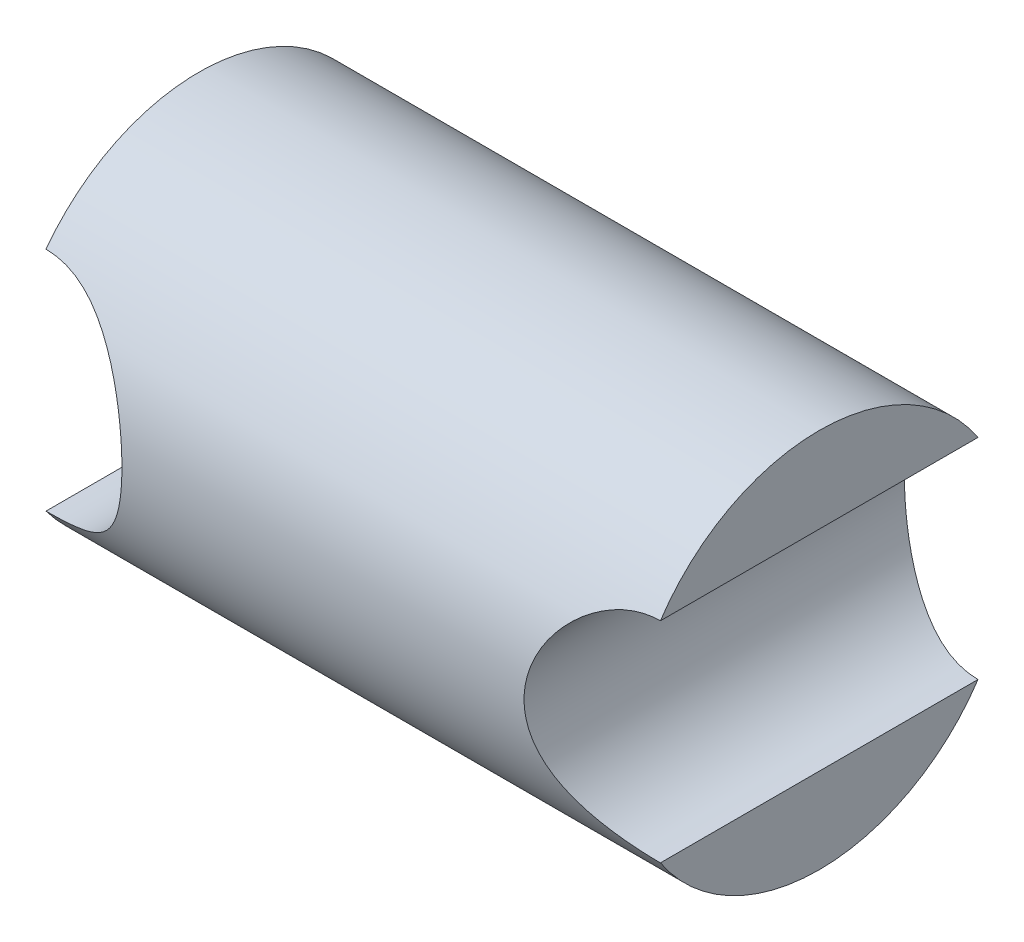
ISO-10303-21;
HEADER;
FILE_DESCRIPTION(('STEP AP214'),'2;1');
FILE_NAME('part.step','',(''),(''),'','','');
FILE_SCHEMA(('AUTOMOTIVE_DESIGN { 1 0 10303 214 1 1 1 1 }'));
ENDSEC;
DATA;
#1=APPLICATION_CONTEXT('core data for automotive mechanical design processes');
#2=APPLICATION_PROTOCOL_DEFINITION('international standard','automotive_design',2000,#1);
#3=PRODUCT_CONTEXT('',#1,'mechanical');
#4=PRODUCT('Part','Part','',(#3));
#5=PRODUCT_RELATED_PRODUCT_CATEGORY('part','',(#4));
#6=PRODUCT_DEFINITION_FORMATION('','',#4);
#7=PRODUCT_DEFINITION_CONTEXT('part definition',#1,'design');
#8=PRODUCT_DEFINITION('design','',#6,#7);
#9=PRODUCT_DEFINITION_SHAPE('','',#8);
#10=(LENGTH_UNIT() NAMED_UNIT(*) SI_UNIT(.MILLI.,.METRE.));
#11=(NAMED_UNIT(*) PLANE_ANGLE_UNIT() SI_UNIT($,.RADIAN.));
#12=(NAMED_UNIT(*) SI_UNIT($,.STERADIAN.) SOLID_ANGLE_UNIT());
#13=UNCERTAINTY_MEASURE_WITH_UNIT(LENGTH_MEASURE(1.E-05),#10,'distance_accuracy_value','');
#14=(GEOMETRIC_REPRESENTATION_CONTEXT(3) GLOBAL_UNCERTAINTY_ASSIGNED_CONTEXT((#13)) GLOBAL_UNIT_ASSIGNED_CONTEXT((#10,
#11,#12)) REPRESENTATION_CONTEXT('',''));
#15=CARTESIAN_POINT('',(0.,0.,0.));
#16=DIRECTION('',(0.,0.,1.));
#17=DIRECTION('',(1.,0.,0.));
#18=AXIS2_PLACEMENT_3D('',#15,#16,#17);
#19=CARTESIAN_POINT('',(75.,0.,0.));
#20=DIRECTION('',(-1.,0.,0.));
#21=DIRECTION('',(0.,0.,1.));
#22=AXIS2_PLACEMENT_3D('',#19,#20,#21);
#23=CYLINDRICAL_SURFACE('',#22,23.);
#24=CARTESIAN_POINT('',(75.,-12.6701406368447,19.1955082309007));
#25=CARTESIAN_POINT('',(74.8369294760517,-12.6703725699019,19.1953515760814));
#26=CARTESIAN_POINT('',(74.6738765209561,-12.6674524483349,19.197283010189));
#27=CARTESIAN_POINT('',(74.348114196428,-12.6553313683796,19.2052770578598));
#28=CARTESIAN_POINT('',(74.1854048090592,-12.6461307464331,19.2113394501303));
#29=CARTESIAN_POINT('',(73.6985568130561,-12.6091674984424,19.2356394955028));
#30=CARTESIAN_POINT('',(73.3753673887891,-12.5720438529932,19.2599898902889));
#31=CARTESIAN_POINT('',(72.7365402763044,-12.4737340733277,19.3238021572105));
#32=CARTESIAN_POINT('',(72.4208661148813,-12.4127137929539,19.3631598233005));
#33=CARTESIAN_POINT('',(71.7969146387665,-12.2674364029484,19.4555236461787));
#34=CARTESIAN_POINT('',(71.4886384537322,-12.1831757687916,19.508531873067));
#35=CARTESIAN_POINT('',(70.8822749260622,-11.9927037483855,19.626195030197));
#36=CARTESIAN_POINT('',(70.5841607617617,-11.8865563719188,19.6908159288654));
#37=CARTESIAN_POINT('',(69.9986688477942,-11.6532194229001,19.8297983823622));
#38=CARTESIAN_POINT('',(69.711290885988,-11.5260302663873,19.9041597445955));
#39=CARTESIAN_POINT('',(69.1479533911269,-11.2513953328332,20.0606858463557));
#40=CARTESIAN_POINT('',(68.8720148260924,-11.1039143277573,20.1428640782016));
#41=CARTESIAN_POINT('',(68.3330510519983,-10.7898212572092,20.3128443216903));
#42=CARTESIAN_POINT('',(68.0700271254207,-10.623207297211,20.400646889868));
#43=CARTESIAN_POINT('',(67.5320472002041,-10.2540885503507,20.5888506364099));
#44=CARTESIAN_POINT('',(67.2585425992587,-10.0496599361237,20.6896318906438));
#45=CARTESIAN_POINT('',(66.7292877351354,-9.61977777649522,20.8929752916031));
#46=CARTESIAN_POINT('',(66.4735385187119,-9.39432299334598,20.9955375428808));
#47=CARTESIAN_POINT('',(65.9807669787859,-8.92328506865594,21.2000218786104));
#48=CARTESIAN_POINT('',(65.743753377776,-8.67769265904466,21.3019436447907));
#49=CARTESIAN_POINT('',(65.2898249129469,-8.16756587392657,21.5026970494471));
#50=CARTESIAN_POINT('',(65.0729035275221,-7.90303769443529,21.6015296836552));
#51=CARTESIAN_POINT('',(64.6422291135284,-7.33203190684531,21.8023099506229));
#52=CARTESIAN_POINT('',(64.4304217535566,-7.02390983191719,21.9037708258536));
#53=CARTESIAN_POINT('',(64.0337472676137,-6.38801941808006,22.0975945369596));
#54=CARTESIAN_POINT('',(63.8488821297613,-6.06024963184464,22.1899567012607));
#55=CARTESIAN_POINT('',(63.5080953831817,-5.38722484606739,22.3628807856803));
#56=CARTESIAN_POINT('',(63.3521577454197,-5.0419796656428,22.4434492355694));
#57=CARTESIAN_POINT('',(63.0710282172252,-4.336284584781,22.590406469527));
#58=CARTESIAN_POINT('',(62.9458322379202,-3.97583671389746,22.6567971391942));
#59=CARTESIAN_POINT('',(62.7369692624769,-3.2730161720505,22.768471919152));
#60=CARTESIAN_POINT('',(62.6507238985723,-2.93161423371946,22.8150475607307));
#61=CARTESIAN_POINT('',(62.5067491610129,-2.24114936007302,22.8931849232233));
#62=CARTESIAN_POINT('',(62.4490183550609,-1.89208681047315,22.9247473982513));
#63=CARTESIAN_POINT('',(62.3629458561969,-1.189506975912,22.9719167496449));
#64=CARTESIAN_POINT('',(62.3345856510173,-0.835992639322882,22.9875336763901));
#65=CARTESIAN_POINT('',(62.3076304049422,-0.127498319987761,23.002374838167));
#66=CARTESIAN_POINT('',(62.3090329698213,0.22748154256914,23.0016003917803));
#67=CARTESIAN_POINT('',(62.3398484328987,0.898227363427973,22.9846384450275));
#68=CARTESIAN_POINT('',(62.3662885407636,1.21417673806282,22.9700867913281));
#69=CARTESIAN_POINT('',(62.4426174189269,1.84235186680296,22.9282534062329));
#70=CARTESIAN_POINT('',(62.4925041647497,2.15457794000675,22.900972773909));
#71=CARTESIAN_POINT('',(62.6151403614973,2.77318369984825,22.8343217506064));
#72=CARTESIAN_POINT('',(62.6878902173517,3.07956328283655,22.794951145502));
#73=CARTESIAN_POINT('',(62.8554564097879,3.68454083274565,22.7050147392627));
#74=CARTESIAN_POINT('',(62.9502735971798,3.98313849913948,22.6544485064819));
#75=CARTESIAN_POINT('',(63.1620685889228,4.5737342542714,22.5426746053772));
#76=CARTESIAN_POINT('',(63.2792559968547,4.86563804583655,22.4813667773894));
#77=CARTESIAN_POINT('',(63.5341068521919,5.43824086938055,22.3497616859956));
#78=CARTESIAN_POINT('',(63.6717701942376,5.71893995900412,22.2794644688451));
#79=CARTESIAN_POINT('',(63.9664966586428,6.26788151321782,22.1313012430599));
#80=CARTESIAN_POINT('',(64.1235608783954,6.53612327198848,22.0534348063323));
#81=CARTESIAN_POINT('',(64.4560739447837,7.05915349220217,21.8916269153879));
#82=CARTESIAN_POINT('',(64.631529396589,7.31393707042162,21.8076832819308));
#83=CARTESIAN_POINT('',(65.0195863667303,7.83567958376827,21.6260582919788));
#84=CARTESIAN_POINT('',(65.2341534660231,8.10100199097447,21.5278703087243));
#85=CARTESIAN_POINT('',(65.6832934450007,8.6128356989984,21.3282567873788));
#86=CARTESIAN_POINT('',(65.9178677882192,8.859345621176,21.2268310127829));
#87=CARTESIAN_POINT('',(66.4061505829152,9.33282750610117,21.0229599570844));
#88=CARTESIAN_POINT('',(66.6598813984113,9.55977594909528,20.9205136094736));
#89=CARTESIAN_POINT('',(67.1851465094215,9.99280595101813,20.7171681348332));
#90=CARTESIAN_POINT('',(67.4566810075925,10.1988872723514,20.6162690254318));
#91=CARTESIAN_POINT('',(68.0416744355119,10.606675542797,20.4096854613166));
#92=CARTESIAN_POINT('',(68.3567081972336,10.8063259115961,20.3043855537698));
#93=CARTESIAN_POINT('',(69.0052598965241,11.1780983946785,20.1021125366637));
#94=CARTESIAN_POINT('',(69.3387805034574,11.3502165194927,20.0051406347879));
#95=CARTESIAN_POINT('',(70.0216322363026,11.6647971440948,19.8233560250293));
#96=CARTESIAN_POINT('',(70.3709202163616,11.8073352306421,19.7385125023719));
#97=CARTESIAN_POINT('',(71.0838159179697,12.0614765958226,19.584252176133));
#98=CARTESIAN_POINT('',(71.4474178326634,12.1730922742804,19.5148291911666));
#99=CARTESIAN_POINT('',(72.0737354153136,12.3346959962137,19.412918156132));
#100=CARTESIAN_POINT('',(72.3335288024108,12.393104332667,19.3756172010098));
#101=CARTESIAN_POINT('',(72.8574324774516,12.4935856461336,19.3109781771066));
#102=CARTESIAN_POINT('',(73.1215415092359,12.5356632912879,19.2836372613779));
#103=CARTESIAN_POINT('',(73.6538535999065,12.6032043638705,19.239567873273));
#104=CARTESIAN_POINT('',(73.9220689039334,12.6285998449352,19.2228828096899));
#105=CARTESIAN_POINT('',(74.4601865058924,12.6622797639718,19.2006959954634));
#106=CARTESIAN_POINT('',(74.7300897013463,12.6705541530702,19.1952008125208));
#107=CARTESIAN_POINT('',(75.,12.6701406368447,19.1955082309007));
#108=B_SPLINE_CURVE_WITH_KNOTS('',3,(#24,#25,#26,#27,#28,#29,#30,#31,#32,#33,#34,#35,#36,#37,
#38,#39,#40,#41,#42,#43,#44,#45,#46,#47,#48,#49,#50,#51,#52,#53,#54,#55,#56,#57,#58,#59,#60,#61,
#62,#63,#64,#65,#66,#67,#68,#69,#70,#71,#72,#73,#74,#75,#76,#77,#78,#79,#80,#81,#82,#83,#84,#85,
#86,#87,#88,#89,#90,#91,#92,#93,#94,#95,#96,#97,#98,#99,#100,#101,#102,#103,#104,#105,#106,
#107),.UNSPECIFIED.,.F.,.F.,(4,2,2,2,2,2,2,2,2,2,2,2,2,2,2,2,2,2,2,2,2,2,2,2,2,2,2,2,2,2,2,2,2,
2,2,2,2,2,2,2,2,4),(0.,0.489121318111132,0.978216436401427,1.95541754270308,2.9259533038266,
3.89663633293911,4.86451978329434,5.83238409888975,6.8019504076495,7.77161280480903,
8.83858314847981,9.90561634120732,10.9731434080519,12.0403227497723,13.2010781423334,
14.3619191459554,15.5221149812596,16.6821564180704,17.7462528188045,18.8102957641309,
19.8736676350518,20.9369539647959,21.8879851064596,22.8389341474032,23.7899000315987,
24.7409025865382,25.7012969313515,26.6616863345961,27.6221300862876,28.5829199688025,
29.6470181256879,30.7111941884156,31.7766324165046,32.8420827744348,34.0032598284113,
35.1646049868051,36.3229449551696,37.4808197569528,38.2868059949857,39.0925616712337,
39.9015791658945,40.7110713622282),.UNSPECIFIED.);
#109=CARTESIAN_POINT('',(75.,-12.6701406368447,19.1955082309007));
#110=VERTEX_POINT('',#109);
#111=CARTESIAN_POINT('',(75.,12.6701406368447,19.1955082309007));
#112=VERTEX_POINT('',#111);
#113=EDGE_CURVE('E82',#110,#112,#108,.T.);
#114=ORIENTED_EDGE('',*,*,#113,.T.);
#115=CARTESIAN_POINT('',(75.,0.,0.));
#116=DIRECTION('',(1.,0.,0.));
#117=DIRECTION('',(0.,0.,-1.));
#118=AXIS2_PLACEMENT_3D('',#115,#116,#117);
#119=CIRCLE('',#118,23.);
#120=CARTESIAN_POINT('',(75.,12.6701406368447,-19.1955082309007));
#121=VERTEX_POINT('',#120);
#122=EDGE_CURVE('E11',#121,#112,#119,.T.);
#123=ORIENTED_EDGE('',*,*,#122,.F.);
#124=CARTESIAN_POINT('',(75.,-12.6701406368447,-19.1955082309007));
#125=CARTESIAN_POINT('',(74.8369294760517,-12.6703725699019,-19.1953515760814));
#126=CARTESIAN_POINT('',(74.6738765209561,-12.6674524483349,-19.197283010189));
#127=CARTESIAN_POINT('',(74.348114196428,-12.6553313683796,-19.2052770578598));
#128=CARTESIAN_POINT('',(74.1854048090592,-12.6461307464331,-19.2113394501303));
#129=CARTESIAN_POINT('',(73.6985568130561,-12.6091674984424,-19.2356394955028));
#130=CARTESIAN_POINT('',(73.3753673887891,-12.5720438529932,-19.2599898902889));
#131=CARTESIAN_POINT('',(72.7365402763044,-12.4737340733277,-19.3238021572105));
#132=CARTESIAN_POINT('',(72.4208661148813,-12.4127137929539,-19.3631598233005));
#133=CARTESIAN_POINT('',(71.7969146387665,-12.2674364029484,-19.4555236461787));
#134=CARTESIAN_POINT('',(71.4886384537322,-12.1831757687916,-19.508531873067));
#135=CARTESIAN_POINT('',(70.8822749260622,-11.9927037483855,-19.626195030197));
#136=CARTESIAN_POINT('',(70.5841607617617,-11.8865563719188,-19.6908159288654));
#137=CARTESIAN_POINT('',(69.9986688477942,-11.6532194229001,-19.8297983823622));
#138=CARTESIAN_POINT('',(69.711290885988,-11.5260302663873,-19.9041597445955));
#139=CARTESIAN_POINT('',(69.1479533911269,-11.2513953328332,-20.0606858463557));
#140=CARTESIAN_POINT('',(68.8720148260924,-11.1039143277573,-20.1428640782016));
#141=CARTESIAN_POINT('',(68.3330510519983,-10.7898212572092,-20.3128443216903));
#142=CARTESIAN_POINT('',(68.0700271254207,-10.623207297211,-20.400646889868));
#143=CARTESIAN_POINT('',(67.5320472002041,-10.2540885503507,-20.5888506364099));
#144=CARTESIAN_POINT('',(67.2585425992587,-10.0496599361237,-20.6896318906438));
#145=CARTESIAN_POINT('',(66.7292877351354,-9.61977777649522,-20.8929752916031));
#146=CARTESIAN_POINT('',(66.4735385187119,-9.39432299334598,-20.9955375428808));
#147=CARTESIAN_POINT('',(65.9807669787859,-8.92328506865594,-21.2000218786104));
#148=CARTESIAN_POINT('',(65.743753377776,-8.67769265904466,-21.3019436447907));
#149=CARTESIAN_POINT('',(65.2898249129469,-8.16756587392657,-21.5026970494471));
#150=CARTESIAN_POINT('',(65.0729035275221,-7.90303769443529,-21.6015296836552));
#151=CARTESIAN_POINT('',(64.6422291135284,-7.33203190684531,-21.8023099506229));
#152=CARTESIAN_POINT('',(64.4304217535566,-7.02390983191719,-21.9037708258536));
#153=CARTESIAN_POINT('',(64.0337472676137,-6.38801941808006,-22.0975945369596));
#154=CARTESIAN_POINT('',(63.8488821297613,-6.06024963184464,-22.1899567012607));
#155=CARTESIAN_POINT('',(63.5080953831817,-5.38722484606739,-22.3628807856803));
#156=CARTESIAN_POINT('',(63.3521577454197,-5.0419796656428,-22.4434492355694));
#157=CARTESIAN_POINT('',(63.0710282172252,-4.336284584781,-22.590406469527));
#158=CARTESIAN_POINT('',(62.9458322379202,-3.97583671389746,-22.6567971391942));
#159=CARTESIAN_POINT('',(62.7369692624769,-3.2730161720505,-22.768471919152));
#160=CARTESIAN_POINT('',(62.6507238985723,-2.93161423371946,-22.8150475607307));
#161=CARTESIAN_POINT('',(62.5067491610129,-2.24114936007302,-22.8931849232233));
#162=CARTESIAN_POINT('',(62.4490183550609,-1.89208681047315,-22.9247473982513));
#163=CARTESIAN_POINT('',(62.3629458561969,-1.189506975912,-22.9719167496449));
#164=CARTESIAN_POINT('',(62.3345856510173,-0.835992639322882,-22.9875336763901));
#165=CARTESIAN_POINT('',(62.3076304049422,-0.127498319987761,-23.002374838167));
#166=CARTESIAN_POINT('',(62.3090329698213,0.22748154256914,-23.0016003917803));
#167=CARTESIAN_POINT('',(62.3398484328987,0.898227363427973,-22.9846384450275));
#168=CARTESIAN_POINT('',(62.3662885407636,1.21417673806282,-22.9700867913281));
#169=CARTESIAN_POINT('',(62.4426174189269,1.84235186680296,-22.9282534062329));
#170=CARTESIAN_POINT('',(62.4925041647497,2.15457794000675,-22.900972773909));
#171=CARTESIAN_POINT('',(62.6151403614973,2.77318369984825,-22.8343217506064));
#172=CARTESIAN_POINT('',(62.6878902173517,3.07956328283655,-22.794951145502));
#173=CARTESIAN_POINT('',(62.8554564097879,3.68454083274565,-22.7050147392627));
#174=CARTESIAN_POINT('',(62.9502735971798,3.98313849913948,-22.6544485064819));
#175=CARTESIAN_POINT('',(63.1620685889228,4.5737342542714,-22.5426746053772));
#176=CARTESIAN_POINT('',(63.2792559968547,4.86563804583655,-22.4813667773894));
#177=CARTESIAN_POINT('',(63.5341068521919,5.43824086938055,-22.3497616859956));
#178=CARTESIAN_POINT('',(63.6717701942376,5.71893995900412,-22.2794644688451));
#179=CARTESIAN_POINT('',(63.9664966586428,6.26788151321782,-22.1313012430599));
#180=CARTESIAN_POINT('',(64.1235608783954,6.53612327198848,-22.0534348063323));
#181=CARTESIAN_POINT('',(64.4560739447837,7.05915349220217,-21.8916269153879));
#182=CARTESIAN_POINT('',(64.631529396589,7.31393707042162,-21.8076832819308));
#183=CARTESIAN_POINT('',(65.0195863667303,7.83567958376827,-21.6260582919788));
#184=CARTESIAN_POINT('',(65.2341534660231,8.10100199097447,-21.5278703087243));
#185=CARTESIAN_POINT('',(65.6832934450007,8.6128356989984,-21.3282567873788));
#186=CARTESIAN_POINT('',(65.9178677882192,8.859345621176,-21.2268310127829));
#187=CARTESIAN_POINT('',(66.4061505829152,9.33282750610117,-21.0229599570844));
#188=CARTESIAN_POINT('',(66.6598813984113,9.55977594909528,-20.9205136094736));
#189=CARTESIAN_POINT('',(67.1851465094215,9.99280595101813,-20.7171681348332));
#190=CARTESIAN_POINT('',(67.4566810075925,10.1988872723514,-20.6162690254318));
#191=CARTESIAN_POINT('',(68.0416744355119,10.606675542797,-20.4096854613166));
#192=CARTESIAN_POINT('',(68.3567081972336,10.8063259115961,-20.3043855537698));
#193=CARTESIAN_POINT('',(69.0052598965241,11.1780983946785,-20.1021125366637));
#194=CARTESIAN_POINT('',(69.3387805034574,11.3502165194927,-20.0051406347879));
#195=CARTESIAN_POINT('',(70.0216322363026,11.6647971440948,-19.8233560250293));
#196=CARTESIAN_POINT('',(70.3709202163616,11.8073352306421,-19.7385125023719));
#197=CARTESIAN_POINT('',(71.0838159179697,12.0614765958226,-19.584252176133));
#198=CARTESIAN_POINT('',(71.4474178326634,12.1730922742804,-19.5148291911666));
#199=CARTESIAN_POINT('',(72.0737354153136,12.3346959962137,-19.412918156132));
#200=CARTESIAN_POINT('',(72.3335288024108,12.393104332667,-19.3756172010098));
#201=CARTESIAN_POINT('',(72.8574324774516,12.4935856461336,-19.3109781771066));
#202=CARTESIAN_POINT('',(73.1215415092359,12.5356632912879,-19.2836372613779));
#203=CARTESIAN_POINT('',(73.6538535999065,12.6032043638705,-19.239567873273));
#204=CARTESIAN_POINT('',(73.9220689039334,12.6285998449352,-19.2228828096899));
#205=CARTESIAN_POINT('',(74.4601865058924,12.6622797639718,-19.2006959954634));
#206=CARTESIAN_POINT('',(74.7300897013463,12.6705541530702,-19.1952008125208));
#207=CARTESIAN_POINT('',(75.,12.6701406368447,-19.1955082309007));
#208=B_SPLINE_CURVE_WITH_KNOTS('',3,(#124,#125,#126,#127,#128,#129,#130,#131,#132,#133,#134,
#135,#136,#137,#138,#139,#140,#141,#142,#143,#144,#145,#146,#147,#148,#149,#150,#151,#152,#153,
#154,#155,#156,#157,#158,#159,#160,#161,#162,#163,#164,#165,#166,#167,#168,#169,#170,#171,#172,
#173,#174,#175,#176,#177,#178,#179,#180,#181,#182,#183,#184,#185,#186,#187,#188,#189,#190,#191,
#192,#193,#194,#195,#196,#197,#198,#199,#200,#201,#202,#203,#204,#205,#206,#207),.UNSPECIFIED.,
.F.,.F.,(4,2,2,2,2,2,2,2,2,2,2,2,2,2,2,2,2,2,2,2,2,2,2,2,2,2,2,2,2,2,2,2,2,2,2,2,2,2,2,2,2,4),
(0.,0.489121318111132,0.978216436401427,1.95541754270308,2.9259533038266,3.89663633293911,
4.86451978329434,5.83238409888975,6.8019504076495,7.77161280480903,8.83858314847981,
9.90561634120732,10.9731434080519,12.0403227497723,13.2010781423334,14.3619191459554,
15.5221149812596,16.6821564180704,17.7462528188045,18.8102957641309,19.8736676350518,
20.9369539647959,21.8879851064596,22.8389341474032,23.7899000315987,24.7409025865382,
25.7012969313515,26.6616863345961,27.6221300862876,28.5829199688025,29.6470181256879,
30.7111941884156,31.7766324165046,32.8420827744348,34.0032598284113,35.1646049868051,
36.3229449551696,37.4808197569528,38.2868059949857,39.0925616712337,39.9015791658945,
40.7110713622282),.UNSPECIFIED.);
#209=CARTESIAN_POINT('',(75.,-12.6701406368447,-19.1955082309007));
#210=VERTEX_POINT('',#209);
#211=EDGE_CURVE('E49',#210,#121,#208,.T.);
#212=ORIENTED_EDGE('',*,*,#211,.F.);
#213=EDGE_CURVE('E42',#110,#210,#119,.T.);
#214=ORIENTED_EDGE('',*,*,#213,.F.);
#215=EDGE_LOOP('',(#114,#123,#212,#214));
#216=FACE_BOUND('',#215,.T.);
#217=CARTESIAN_POINT('',(0.,13.7098613613582,-18.4672602584232));
#218=CARTESIAN_POINT('',(0.173631173285071,13.7098634078061,-18.467254338337));
#219=CARTESIAN_POINT('',(0.347235637013716,13.7065620587391,-18.4697101369709));
#220=CARTESIAN_POINT('',(0.694045896536872,13.6933818638141,-18.4794857007419));
#221=CARTESIAN_POINT('',(0.867251718877372,13.6835034694398,-18.4868051320133));
#222=CARTESIAN_POINT('',(1.38537422906297,13.6440775478072,-18.515946852298));
#223=CARTESIAN_POINT('',(1.72921438733528,13.604739128532,-18.5449528521163));
#224=CARTESIAN_POINT('',(2.40822553040273,13.5010313139217,-18.6205850801256));
#225=CARTESIAN_POINT('',(2.74344355265676,13.4368621981128,-18.6670702420765));
#226=CARTESIAN_POINT('',(3.40578235037971,13.2844441882134,-18.7758434399975));
#227=CARTESIAN_POINT('',(3.73290151999934,13.1961905596721,-18.8381345828838));
#228=CARTESIAN_POINT('',(4.3759137817575,12.9970969426961,-18.9760385579418));
#229=CARTESIAN_POINT('',(4.69184366393033,12.8863410250492,-19.0516016663515));
#230=CARTESIAN_POINT('',(5.31221679442057,12.643249032975,-19.2137878061221));
#231=CARTESIAN_POINT('',(5.61666038092688,12.5109135945211,-19.3004105115275));
#232=CARTESIAN_POINT('',(6.51252017122838,12.0824557962526,-19.57367667907));
#233=CARTESIAN_POINT('',(7.08549617289716,11.7551860317354,-19.7734975682965));
#234=CARTESIAN_POINT('',(7.93442838314745,11.1866002862225,-20.0976467929225));
#235=CARTESIAN_POINT('',(8.23018696835755,10.9707832764498,-20.2165267858857));
#236=CARTESIAN_POINT('',(8.80310434782671,10.5166125897946,-20.4564595672112));
#237=CARTESIAN_POINT('',(9.08026207629133,10.2782576234111,-20.5775124795749));
#238=CARTESIAN_POINT('',(9.61489558964681,9.77996448325967,-20.8189574900027));
#239=CARTESIAN_POINT('',(9.87236521324642,9.52001960570189,-20.9393493703484));
#240=CARTESIAN_POINT('',(10.3664180174016,8.9795168082751,-21.1767657457066));
#241=CARTESIAN_POINT('',(10.6030001639969,8.69895786923851,-21.2937900738273));
#242=CARTESIAN_POINT('',(11.0779929135483,8.08726456191373,-21.5340493952516));
#243=CARTESIAN_POINT('',(11.3139136966804,7.75392630267136,-21.6566180517658));
#244=CARTESIAN_POINT('',(11.7565624619767,7.06478902630954,-21.8911221421538));
#245=CARTESIAN_POINT('',(11.9632878239786,6.70898799739515,-22.0030566213617));
#246=CARTESIAN_POINT('',(12.3451910743867,5.97718746974276,-22.2130145776261));
#247=CARTESIAN_POINT('',(12.5203889942287,5.60120099472727,-22.3110468791878));
#248=CARTESIAN_POINT('',(12.8370793232721,4.83143983789782,-22.4902924455207));
#249=CARTESIAN_POINT('',(12.9785771864519,4.43766804672712,-22.5715084315468));
#250=CARTESIAN_POINT('',(13.2140123667437,3.67349794390084,-22.7077413290066));
#251=CARTESIAN_POINT('',(13.3111799565697,3.3044058786306,-22.7645084676913));
#252=CARTESIAN_POINT('',(13.4746887674125,2.55720063302673,-22.8605018787111));
#253=CARTESIAN_POINT('',(13.5410317582259,2.1790879719221,-22.8997291580935));
#254=CARTESIAN_POINT('',(13.6417947238916,1.41745741401439,-22.9594559782168));
#255=CARTESIAN_POINT('',(13.6762391890417,1.03394389381358,-22.9799698860874));
#256=CARTESIAN_POINT('',(13.7127063179883,0.264847164097725,-23.0016910430112));
#257=CARTESIAN_POINT('',(13.7147322168449,-0.120735835061872,-23.0029002184905));
#258=CARTESIAN_POINT('',(13.6880876497439,-0.843042781843045,-22.9870262050703));
#259=CARTESIAN_POINT('',(13.6631499754101,-1.17996144319744,-22.9721674066167));
#260=CARTESIAN_POINT('',(13.5886409132091,-1.85006950685503,-22.9279296787651));
#261=CARTESIAN_POINT('',(13.539072028353,-2.1832592845684,-22.8985522247472));
#262=CARTESIAN_POINT('',(13.4159198439374,-2.84362915367209,-22.8259531597093));
#263=CARTESIAN_POINT('',(13.3423358109881,-3.17080906120684,-22.7827311258955));
#264=CARTESIAN_POINT('',(13.1720112821305,-3.81707992025708,-22.6834036073774));
#265=CARTESIAN_POINT('',(13.075269835987,-4.13617053924446,-22.6272975939992));
#266=CARTESIAN_POINT('',(12.858992709608,-4.7663698137956,-22.5030112829041));
#267=CARTESIAN_POINT('',(12.7393199439757,-5.07741700267347,-22.4347585553987));
#268=CARTESIAN_POINT('',(12.4787154780764,-5.68789226565015,-22.2878097558823));
#269=CARTESIAN_POINT('',(12.337783967387,-5.98732044333295,-22.2091137770011));
#270=CARTESIAN_POINT('',(12.035811374531,-6.57329436262611,-22.0427896379089));
#271=CARTESIAN_POINT('',(11.8747683129651,-6.85983883242819,-21.9551605986533));
#272=CARTESIAN_POINT('',(11.5337068982145,-7.41897353004722,-21.772582511671));
#273=CARTESIAN_POINT('',(11.3536865821777,-7.69156231006116,-21.6776327070177));
#274=CARTESIAN_POINT('',(10.953338652673,-8.25332110413633,-21.4705052646217));
#275=CARTESIAN_POINT('',(10.7307624606249,-8.54062933879437,-21.3576193162945));
#276=CARTESIAN_POINT('',(10.2645541327606,-9.09563657375375,-21.1272265074239));
#277=CARTESIAN_POINT('',(10.0209205477898,-9.36333422212276,-21.0097193291547));
#278=CARTESIAN_POINT('',(9.51340209677736,-9.87858442634789,-20.7724367531004));
#279=CARTESIAN_POINT('',(9.24948734366126,-10.1261060996461,-20.6526582116539));
#280=CARTESIAN_POINT('',(8.70279276085088,-10.5996467996569,-20.4136682220598));
#281=CARTESIAN_POINT('',(8.42001206816732,-10.8256648415748,-20.2944568001217));
#282=CARTESIAN_POINT('',(7.80303977436581,-11.2798886352163,-20.0459111166419));
#283=CARTESIAN_POINT('',(7.46666955825996,-11.5053794684233,-19.9169814640996));
#284=CARTESIAN_POINT('',(6.94653385294067,-11.82146964078,-19.7298726831646));
#285=CARTESIAN_POINT('',(6.77054044804799,-11.9231509447541,-19.6685449737099));
#286=CARTESIAN_POINT('',(6.41343793290975,-12.1189768365047,-19.5484933100602));
#287=CARTESIAN_POINT('',(6.23232669112054,-12.2131182194522,-19.4897704677406));
#288=CARTESIAN_POINT('',(5.6829597431414,-12.4832044571888,-19.3187709898547));
#289=CARTESIAN_POINT('',(5.30742387118331,-12.647570593384,-19.2112079721215));
#290=CARTESIAN_POINT('',(4.53924846948758,-12.9431354946156,-19.013336000777));
#291=CARTESIAN_POINT('',(4.14661561298065,-13.0743470667647,-18.9230203880537));
#292=CARTESIAN_POINT('',(3.44709625573007,-13.2730916023545,-18.7839245263934));
#293=CARTESIAN_POINT('',(3.1433302233867,-13.3483431865178,-18.7304057376951));
#294=CARTESIAN_POINT('',(2.52939444826377,-13.4781621583123,-18.6372087319558));
#295=CARTESIAN_POINT('',(2.21922681571298,-13.5327362507856,-18.5975260287868));
#296=CARTESIAN_POINT('',(1.59222201603777,-13.6207912475583,-18.5331344141141));
#297=CARTESIAN_POINT('',(1.27535449687416,-13.6541318711156,-18.508525126419));
#298=CARTESIAN_POINT('',(0.798198603671077,-13.6875369695018,-18.4838171757518));
#299=CARTESIAN_POINT('',(0.638750633702272,-13.6959043879779,-18.477615476042));
#300=CARTESIAN_POINT('',(0.319542004780746,-13.7070675203773,-18.4693347444393));
#301=CARTESIAN_POINT('',(0.159781324867908,-13.7098628470573,-18.4672559990792));
#302=CARTESIAN_POINT('',(0.,-13.7098613613582,-18.4672602584232));
#303=B_SPLINE_CURVE_WITH_KNOTS('',3,(#217,#218,#219,#220,#221,#222,#223,#224,#225,#226,#227,
#228,#229,#230,#231,#232,#233,#234,#235,#236,#237,#238,#239,#240,#241,#242,#243,#244,#245,#246,
#247,#248,#249,#250,#251,#252,#253,#254,#255,#256,#257,#258,#259,#260,#261,#262,#263,#264,#265,
#266,#267,#268,#269,#270,#271,#272,#273,#274,#275,#276,#277,#278,#279,#280,#281,#282,#283,#284,
#285,#286,#287,#288,#289,#290,#291,#292,#293,#294,#295,#296,#297,#298,#299,#300,#301,#302),
.UNSPECIFIED.,.F.,.F.,(4,2,2,2,2,2,2,2,2,2,2,2,2,2,2,2,2,2,2,2,2,2,2,2,2,2,2,2,2,2,2,2,2,2,2,2,
2,2,2,2,2,2,4),(0.,0.520792332404333,1.04154891852634,2.08181184648814,3.11385346515432,
4.14609810533811,5.17455484452049,6.20298127937041,8.26292180850514,9.41690452081353,
10.5709532978292,11.7253617628817,12.8798273408128,14.1572714693302,15.4348301701606,
16.7115742665909,17.9881115956078,19.1440521718772,20.2999263715331,21.4549124038525,
22.6097831789857,23.6230718412105,24.6362575546053,25.6494742122029,26.6627324529965,
27.6822484928894,28.7017554416625,29.7213628105465,30.7410757429475,31.8816012089113,
33.0222052276031,34.1645235606618,35.3068941829408,36.5801182730769,37.2168557904796,
37.8538625312675,39.1233051863038,40.3922567223709,41.3437696056832,42.2949736887428,
43.252398518709,43.7316305759301,44.2108959371498),.UNSPECIFIED.);
#304=CARTESIAN_POINT('',(0.,13.7098613613582,-18.4672602584232));
#305=VERTEX_POINT('',#304);
#306=CARTESIAN_POINT('',(0.,-13.7098613613582,-18.4672602584232));
#307=VERTEX_POINT('',#306);
#308=EDGE_CURVE('E73',#305,#307,#303,.T.);
#309=ORIENTED_EDGE('',*,*,#308,.F.);
#310=CARTESIAN_POINT('',(0.,0.,0.));
#311=DIRECTION('',(1.,0.,0.));
#312=DIRECTION('',(0.,0.,-1.));
#313=AXIS2_PLACEMENT_3D('',#310,#311,#312);
#314=CIRCLE('',#313,23.);
#315=CARTESIAN_POINT('',(0.,13.7098613613582,18.4672602584232));
#316=VERTEX_POINT('',#315);
#317=EDGE_CURVE('E37',#305,#316,#314,.T.);
#318=ORIENTED_EDGE('',*,*,#317,.T.);
#319=CARTESIAN_POINT('',(0.,13.7098613613582,18.4672602584232));
#320=CARTESIAN_POINT('',(0.173631173285071,13.7098634078061,18.467254338337));
#321=CARTESIAN_POINT('',(0.347235637013716,13.7065620587391,18.4697101369709));
#322=CARTESIAN_POINT('',(0.694045896536872,13.6933818638141,18.4794857007419));
#323=CARTESIAN_POINT('',(0.867251718877372,13.6835034694398,18.4868051320133));
#324=CARTESIAN_POINT('',(1.38537422906297,13.6440775478072,18.515946852298));
#325=CARTESIAN_POINT('',(1.72921438733528,13.604739128532,18.5449528521163));
#326=CARTESIAN_POINT('',(2.40822553040273,13.5010313139217,18.6205850801256));
#327=CARTESIAN_POINT('',(2.74344355265676,13.4368621981128,18.6670702420765));
#328=CARTESIAN_POINT('',(3.40578235037971,13.2844441882134,18.7758434399975));
#329=CARTESIAN_POINT('',(3.73290151999934,13.1961905596721,18.8381345828838));
#330=CARTESIAN_POINT('',(4.3759137817575,12.9970969426961,18.9760385579418));
#331=CARTESIAN_POINT('',(4.69184366393033,12.8863410250492,19.0516016663515));
#332=CARTESIAN_POINT('',(5.31221679442057,12.643249032975,19.2137878061221));
#333=CARTESIAN_POINT('',(5.61666038092688,12.5109135945211,19.3004105115275));
#334=CARTESIAN_POINT('',(6.51252017122838,12.0824557962526,19.57367667907));
#335=CARTESIAN_POINT('',(7.08549617289716,11.7551860317354,19.7734975682965));
#336=CARTESIAN_POINT('',(7.93442838314745,11.1866002862225,20.0976467929225));
#337=CARTESIAN_POINT('',(8.23018696835755,10.9707832764498,20.2165267858857));
#338=CARTESIAN_POINT('',(8.80310434782671,10.5166125897946,20.4564595672112));
#339=CARTESIAN_POINT('',(9.08026207629133,10.2782576234111,20.5775124795749));
#340=CARTESIAN_POINT('',(9.61489558964681,9.77996448325967,20.8189574900027));
#341=CARTESIAN_POINT('',(9.87236521324642,9.52001960570189,20.9393493703484));
#342=CARTESIAN_POINT('',(10.3664180174016,8.9795168082751,21.1767657457066));
#343=CARTESIAN_POINT('',(10.6030001639969,8.69895786923851,21.2937900738273));
#344=CARTESIAN_POINT('',(11.0779929135483,8.08726456191373,21.5340493952516));
#345=CARTESIAN_POINT('',(11.3139136966804,7.75392630267136,21.6566180517658));
#346=CARTESIAN_POINT('',(11.7565624619767,7.06478902630954,21.8911221421538));
#347=CARTESIAN_POINT('',(11.9632878239786,6.70898799739515,22.0030566213617));
#348=CARTESIAN_POINT('',(12.3451910743867,5.97718746974276,22.2130145776261));
#349=CARTESIAN_POINT('',(12.5203889942287,5.60120099472727,22.3110468791878));
#350=CARTESIAN_POINT('',(12.8370793232721,4.83143983789782,22.4902924455207));
#351=CARTESIAN_POINT('',(12.9785771864519,4.43766804672712,22.5715084315468));
#352=CARTESIAN_POINT('',(13.2140123667437,3.67349794390084,22.7077413290066));
#353=CARTESIAN_POINT('',(13.3111799565697,3.3044058786306,22.7645084676913));
#354=CARTESIAN_POINT('',(13.4746887674125,2.55720063302673,22.8605018787111));
#355=CARTESIAN_POINT('',(13.5410317582259,2.1790879719221,22.8997291580935));
#356=CARTESIAN_POINT('',(13.6417947238916,1.41745741401439,22.9594559782168));
#357=CARTESIAN_POINT('',(13.6762391890417,1.03394389381358,22.9799698860874));
#358=CARTESIAN_POINT('',(13.7127063179883,0.264847164097725,23.0016910430112));
#359=CARTESIAN_POINT('',(13.7147322168449,-0.120735835061872,23.0029002184905));
#360=CARTESIAN_POINT('',(13.6880876497439,-0.843042781843045,22.9870262050703));
#361=CARTESIAN_POINT('',(13.6631499754101,-1.17996144319744,22.9721674066167));
#362=CARTESIAN_POINT('',(13.5886409132091,-1.85006950685503,22.9279296787651));
#363=CARTESIAN_POINT('',(13.539072028353,-2.1832592845684,22.8985522247472));
#364=CARTESIAN_POINT('',(13.4159198439374,-2.84362915367209,22.8259531597093));
#365=CARTESIAN_POINT('',(13.3423358109881,-3.17080906120684,22.7827311258955));
#366=CARTESIAN_POINT('',(13.1720112821305,-3.81707992025708,22.6834036073774));
#367=CARTESIAN_POINT('',(13.075269835987,-4.13617053924446,22.6272975939992));
#368=CARTESIAN_POINT('',(12.858992709608,-4.7663698137956,22.5030112829041));
#369=CARTESIAN_POINT('',(12.7393199439757,-5.07741700267347,22.4347585553987));
#370=CARTESIAN_POINT('',(12.4787154780764,-5.68789226565015,22.2878097558823));
#371=CARTESIAN_POINT('',(12.337783967387,-5.98732044333295,22.2091137770011));
#372=CARTESIAN_POINT('',(12.035811374531,-6.57329436262611,22.0427896379089));
#373=CARTESIAN_POINT('',(11.8747683129651,-6.85983883242819,21.9551605986533));
#374=CARTESIAN_POINT('',(11.5337068982145,-7.41897353004722,21.772582511671));
#375=CARTESIAN_POINT('',(11.3536865821777,-7.69156231006116,21.6776327070177));
#376=CARTESIAN_POINT('',(10.953338652673,-8.25332110413633,21.4705052646217));
#377=CARTESIAN_POINT('',(10.7307624606249,-8.54062933879437,21.3576193162945));
#378=CARTESIAN_POINT('',(10.2645541327606,-9.09563657375375,21.1272265074239));
#379=CARTESIAN_POINT('',(10.0209205477898,-9.36333422212276,21.0097193291547));
#380=CARTESIAN_POINT('',(9.51340209677736,-9.87858442634789,20.7724367531004));
#381=CARTESIAN_POINT('',(9.24948734366126,-10.1261060996461,20.6526582116539));
#382=CARTESIAN_POINT('',(8.70279276085088,-10.5996467996569,20.4136682220598));
#383=CARTESIAN_POINT('',(8.42001206816732,-10.8256648415748,20.2944568001217));
#384=CARTESIAN_POINT('',(7.80303977436581,-11.2798886352163,20.0459111166419));
#385=CARTESIAN_POINT('',(7.46666955825996,-11.5053794684233,19.9169814640996));
#386=CARTESIAN_POINT('',(6.94653385294067,-11.82146964078,19.7298726831646));
#387=CARTESIAN_POINT('',(6.77054044804799,-11.9231509447541,19.6685449737099));
#388=CARTESIAN_POINT('',(6.41343793290975,-12.1189768365047,19.5484933100602));
#389=CARTESIAN_POINT('',(6.23232669112054,-12.2131182194522,19.4897704677406));
#390=CARTESIAN_POINT('',(5.6829597431414,-12.4832044571888,19.3187709898547));
#391=CARTESIAN_POINT('',(5.30742387118331,-12.647570593384,19.2112079721215));
#392=CARTESIAN_POINT('',(4.53924846948758,-12.9431354946156,19.013336000777));
#393=CARTESIAN_POINT('',(4.14661561298065,-13.0743470667647,18.9230203880537));
#394=CARTESIAN_POINT('',(3.44709625573007,-13.2730916023545,18.7839245263934));
#395=CARTESIAN_POINT('',(3.1433302233867,-13.3483431865178,18.7304057376951));
#396=CARTESIAN_POINT('',(2.52939444826377,-13.4781621583123,18.6372087319558));
#397=CARTESIAN_POINT('',(2.21922681571298,-13.5327362507856,18.5975260287868));
#398=CARTESIAN_POINT('',(1.59222201603777,-13.6207912475583,18.5331344141141));
#399=CARTESIAN_POINT('',(1.27535449687416,-13.6541318711156,18.508525126419));
#400=CARTESIAN_POINT('',(0.798198603671077,-13.6875369695018,18.4838171757518));
#401=CARTESIAN_POINT('',(0.638750633702272,-13.6959043879779,18.477615476042));
#402=CARTESIAN_POINT('',(0.319542004780746,-13.7070675203773,18.4693347444393));
#403=CARTESIAN_POINT('',(0.159781324867908,-13.7098628470573,18.4672559990792));
#404=CARTESIAN_POINT('',(0.,-13.7098613613582,18.4672602584232));
#405=B_SPLINE_CURVE_WITH_KNOTS('',3,(#319,#320,#321,#322,#323,#324,#325,#326,#327,#328,#329,
#330,#331,#332,#333,#334,#335,#336,#337,#338,#339,#340,#341,#342,#343,#344,#345,#346,#347,#348,
#349,#350,#351,#352,#353,#354,#355,#356,#357,#358,#359,#360,#361,#362,#363,#364,#365,#366,#367,
#368,#369,#370,#371,#372,#373,#374,#375,#376,#377,#378,#379,#380,#381,#382,#383,#384,#385,#386,
#387,#388,#389,#390,#391,#392,#393,#394,#395,#396,#397,#398,#399,#400,#401,#402,#403,#404),
.UNSPECIFIED.,.F.,.F.,(4,2,2,2,2,2,2,2,2,2,2,2,2,2,2,2,2,2,2,2,2,2,2,2,2,2,2,2,2,2,2,2,2,2,2,2,
2,2,2,2,2,2,4),(0.,0.520792332404333,1.04154891852634,2.08181184648814,3.11385346515432,
4.14609810533811,5.17455484452049,6.20298127937041,8.26292180850514,9.41690452081353,
10.5709532978292,11.7253617628817,12.8798273408128,14.1572714693302,15.4348301701606,
16.7115742665909,17.9881115956078,19.1440521718772,20.2999263715331,21.4549124038525,
22.6097831789857,23.6230718412105,24.6362575546053,25.6494742122029,26.6627324529965,
27.6822484928894,28.7017554416625,29.7213628105465,30.7410757429475,31.8816012089113,
33.0222052276031,34.1645235606618,35.3068941829408,36.5801182730769,37.2168557904796,
37.8538625312675,39.1233051863038,40.3922567223709,41.3437696056832,42.2949736887428,
43.252398518709,43.7316305759301,44.2108959371498),.UNSPECIFIED.);
#406=CARTESIAN_POINT('',(0.,-13.7098613613582,18.4672602584232));
#407=VERTEX_POINT('',#406);
#408=EDGE_CURVE('E57',#316,#407,#405,.T.);
#409=ORIENTED_EDGE('',*,*,#408,.T.);
#410=EDGE_CURVE('E87',#407,#307,#314,.T.);
#411=ORIENTED_EDGE('',*,*,#410,.T.);
#412=EDGE_LOOP('',(#309,#318,#409,#411));
#413=FACE_BOUND('',#412,.T.);
#414=ADVANCED_FACE('F34',(#216,#413),#23,.T.);
#415=CARTESIAN_POINT('',(75.,0.,0.));
#416=DIRECTION('',(1.,0.,0.));
#417=DIRECTION('',(0.,0.,-1.));
#418=AXIS2_PLACEMENT_3D('',#415,#416,#417);
#419=PLANE('',#418);
#420=ORIENTED_EDGE('',*,*,#213,.T.);
#421=DIRECTION('',(0.,0.,-1.));
#422=VECTOR('',#421,1.);
#423=CARTESIAN_POINT('',(75.,-12.6701406368447,23.001));
#424=LINE('',#423,#422);
#425=EDGE_CURVE('E137',#110,#210,#424,.T.);
#426=ORIENTED_EDGE('',*,*,#425,.F.);
#427=EDGE_LOOP('',(#420,#426));
#428=FACE_BOUND('',#427,.T.);
#429=ADVANCED_FACE('F126',(#428),#419,.T.);
#430=ORIENTED_EDGE('',*,*,#122,.T.);
#431=DIRECTION('',(0.,0.,-1.));
#432=VECTOR('',#431,1.);
#433=CARTESIAN_POINT('',(75.,12.6701406368447,23.001));
#434=LINE('',#433,#432);
#435=EDGE_CURVE('E140',#121,#112,#434,.F.);
#436=ORIENTED_EDGE('',*,*,#435,.F.);
#437=EDGE_LOOP('',(#430,#436));
#438=FACE_BOUND('',#437,.T.);
#439=ADVANCED_FACE('F123',(#438),#419,.T.);
#440=CARTESIAN_POINT('',(0.,0.,0.));
#441=DIRECTION('',(1.,0.,0.));
#442=DIRECTION('',(0.,0.,-1.));
#443=AXIS2_PLACEMENT_3D('',#440,#441,#442);
#444=PLANE('',#443);
#445=DIRECTION('',(0.,0.,-1.));
#446=VECTOR('',#445,1.);
#447=CARTESIAN_POINT('',(0.,-13.7098613613582,23.001));
#448=LINE('',#447,#446);
#449=EDGE_CURVE('E76',#407,#307,#448,.T.);
#450=ORIENTED_EDGE('',*,*,#449,.T.);
#451=ORIENTED_EDGE('',*,*,#410,.F.);
#452=EDGE_LOOP('',(#450,#451));
#453=FACE_BOUND('',#452,.T.);
#454=ADVANCED_FACE('F86',(#453),#444,.F.);
#455=DIRECTION('',(0.,0.,-1.));
#456=VECTOR('',#455,1.);
#457=CARTESIAN_POINT('',(0.,13.7098613613582,23.001));
#458=LINE('',#457,#456);
#459=EDGE_CURVE('E77',#305,#316,#458,.F.);
#460=ORIENTED_EDGE('',*,*,#459,.T.);
#461=ORIENTED_EDGE('',*,*,#317,.F.);
#462=EDGE_LOOP('',(#460,#461));
#463=FACE_BOUND('',#462,.T.);
#464=ADVANCED_FACE('F116',(#463),#444,.F.);
#465=CARTESIAN_POINT('',(0.,0.,23.001));
#466=DIRECTION('',(0.,0.,-1.));
#467=DIRECTION('',(-1.,0.,0.));
#468=AXIS2_PLACEMENT_3D('',#465,#466,#467);
#469=CYLINDRICAL_SURFACE('',#468,13.7098613613582);
#470=ORIENTED_EDGE('',*,*,#408,.F.);
#471=ORIENTED_EDGE('',*,*,#459,.F.);
#472=ORIENTED_EDGE('',*,*,#308,.T.);
#473=ORIENTED_EDGE('',*,*,#449,.F.);
#474=EDGE_LOOP('',(#470,#471,#472,#473));
#475=FACE_BOUND('',#474,.T.);
#476=ADVANCED_FACE('F75',(#475),#469,.F.);
#477=CARTESIAN_POINT('',(74.9820995167501,0.,23.001));
#478=DIRECTION('',(0.,0.,-1.));
#479=DIRECTION('',(-1.,0.,0.));
#480=AXIS2_PLACEMENT_3D('',#477,#478,#479);
#481=CYLINDRICAL_SURFACE('',#480,12.6701532818164);
#482=ORIENTED_EDGE('',*,*,#425,.T.);
#483=ORIENTED_EDGE('',*,*,#211,.T.);
#484=ORIENTED_EDGE('',*,*,#435,.T.);
#485=ORIENTED_EDGE('',*,*,#113,.F.);
#486=EDGE_LOOP('',(#482,#483,#484,#485));
#487=FACE_BOUND('',#486,.T.);
#488=ADVANCED_FACE('F122',(#487),#481,.F.);
#489=CLOSED_SHELL('',(#414,#429,#439,#454,#464,#476,#488));
#490=MANIFOLD_SOLID_BREP('B2',#489);
#491=ADVANCED_BREP_SHAPE_REPRESENTATION('',(#18,#490),#14);
#492=SHAPE_DEFINITION_REPRESENTATION(#9,#491);
ENDSEC;
END-ISO-10303-21;
